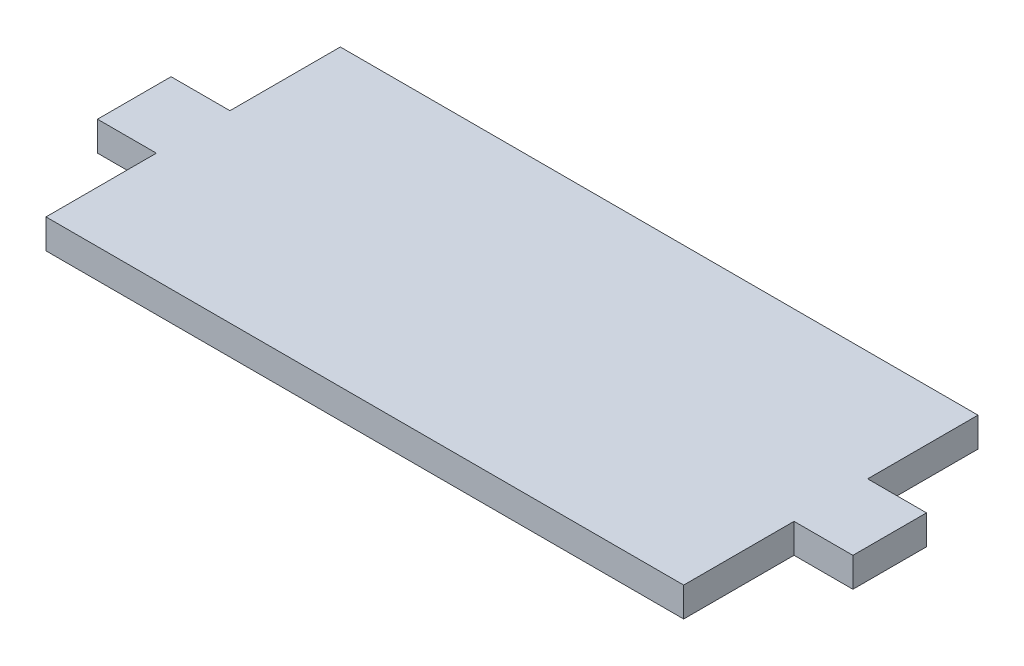
ISO-10303-21;
HEADER;
FILE_DESCRIPTION(('STEP AP214'),'2;1');
FILE_NAME('part.step','',(''),(''),'','','');
FILE_SCHEMA(('AUTOMOTIVE_DESIGN { 1 0 10303 214 1 1 1 1 }'));
ENDSEC;
DATA;
#1=APPLICATION_CONTEXT('core data for automotive mechanical design processes');
#2=APPLICATION_PROTOCOL_DEFINITION('international standard','automotive_design',2000,#1);
#3=PRODUCT_CONTEXT('',#1,'mechanical');
#4=PRODUCT('Part','Part','',(#3));
#5=PRODUCT_RELATED_PRODUCT_CATEGORY('part','',(#4));
#6=PRODUCT_DEFINITION_FORMATION('','',#4);
#7=PRODUCT_DEFINITION_CONTEXT('part definition',#1,'design');
#8=PRODUCT_DEFINITION('design','',#6,#7);
#9=PRODUCT_DEFINITION_SHAPE('','',#8);
#10=(LENGTH_UNIT() NAMED_UNIT(*) SI_UNIT(.MILLI.,.METRE.));
#11=(NAMED_UNIT(*) PLANE_ANGLE_UNIT() SI_UNIT($,.RADIAN.));
#12=(NAMED_UNIT(*) SI_UNIT($,.STERADIAN.) SOLID_ANGLE_UNIT());
#13=UNCERTAINTY_MEASURE_WITH_UNIT(LENGTH_MEASURE(1.E-05),#10,'distance_accuracy_value','');
#14=(GEOMETRIC_REPRESENTATION_CONTEXT(3) GLOBAL_UNCERTAINTY_ASSIGNED_CONTEXT((#13)) GLOBAL_UNIT_ASSIGNED_CONTEXT((#10,
#11,#12)) REPRESENTATION_CONTEXT('',''));
#15=CARTESIAN_POINT('',(0.,0.,0.));
#16=DIRECTION('',(0.,0.,1.));
#17=DIRECTION('',(1.,0.,0.));
#18=AXIS2_PLACEMENT_3D('',#15,#16,#17);
#19=CARTESIAN_POINT('',(-64.9999999999999,6.,7.50000000000009));
#20=DIRECTION('',(1.,0.,0.));
#21=DIRECTION('',(0.,0.,-1.));
#22=AXIS2_PLACEMENT_3D('',#19,#20,#21);
#23=PLANE('',#22);
#24=DIRECTION('',(0.,0.,1.));
#25=VECTOR('',#24,1.);
#26=CARTESIAN_POINT('',(-64.9999999999999,0.,7.50000000000009));
#27=LINE('',#26,#25);
#28=CARTESIAN_POINT('',(-64.9999999999999,0.,7.50000000000009));
#29=VERTEX_POINT('',#28);
#30=CARTESIAN_POINT('',(-65.,0.,30.));
#31=VERTEX_POINT('',#30);
#32=EDGE_CURVE('E151',#29,#31,#27,.T.);
#33=ORIENTED_EDGE('',*,*,#32,.T.);
#34=DIRECTION('',(0.,-1.,0.));
#35=VECTOR('',#34,1.);
#36=CARTESIAN_POINT('',(-65.,6.,30.));
#37=LINE('',#36,#35);
#38=CARTESIAN_POINT('',(-65.,6.,30.));
#39=VERTEX_POINT('',#38);
#40=EDGE_CURVE('E11',#39,#31,#37,.T.);
#41=ORIENTED_EDGE('',*,*,#40,.F.);
#42=DIRECTION('',(0.,0.,1.));
#43=VECTOR('',#42,1.);
#44=CARTESIAN_POINT('',(-64.9999999999999,6.,7.50000000000009));
#45=LINE('',#44,#43);
#46=CARTESIAN_POINT('',(-64.9999999999999,6.,7.50000000000009));
#47=VERTEX_POINT('',#46);
#48=EDGE_CURVE('E173',#47,#39,#45,.T.);
#49=ORIENTED_EDGE('',*,*,#48,.F.);
#50=DIRECTION('',(0.,-1.,0.));
#51=VECTOR('',#50,1.);
#52=CARTESIAN_POINT('',(-64.9999999999999,6.,7.50000000000009));
#53=LINE('',#52,#51);
#54=EDGE_CURVE('E147',#47,#29,#53,.T.);
#55=ORIENTED_EDGE('',*,*,#54,.T.);
#56=EDGE_LOOP('',(#33,#41,#49,#55));
#57=FACE_BOUND('',#56,.T.);
#58=ADVANCED_FACE('F31',(#57),#23,.F.);
#59=CARTESIAN_POINT('',(65.,6.,30.));
#60=DIRECTION('',(0.,0.,-1.));
#61=DIRECTION('',(-1.,0.,0.));
#62=AXIS2_PLACEMENT_3D('',#59,#60,#61);
#63=PLANE('',#62);
#64=DIRECTION('',(1.,0.,0.));
#65=VECTOR('',#64,1.);
#66=CARTESIAN_POINT('',(65.,0.,30.));
#67=LINE('',#66,#65);
#68=CARTESIAN_POINT('',(65.,0.,30.));
#69=VERTEX_POINT('',#68);
#70=EDGE_CURVE('E154',#31,#69,#67,.T.);
#71=ORIENTED_EDGE('',*,*,#70,.T.);
#72=DIRECTION('',(0.,-1.,0.));
#73=VECTOR('',#72,1.);
#74=CARTESIAN_POINT('',(65.,6.,30.));
#75=LINE('',#74,#73);
#76=CARTESIAN_POINT('',(65.,6.,30.));
#77=VERTEX_POINT('',#76);
#78=EDGE_CURVE('E39',#77,#69,#75,.T.);
#79=ORIENTED_EDGE('',*,*,#78,.F.);
#80=DIRECTION('',(1.,0.,0.));
#81=VECTOR('',#80,1.);
#82=CARTESIAN_POINT('',(65.,6.,30.));
#83=LINE('',#82,#81);
#84=EDGE_CURVE('E102',#39,#77,#83,.T.);
#85=ORIENTED_EDGE('',*,*,#84,.F.);
#86=ORIENTED_EDGE('',*,*,#40,.T.);
#87=EDGE_LOOP('',(#71,#79,#85,#86));
#88=FACE_BOUND('',#87,.T.);
#89=ADVANCED_FACE('F251',(#88),#63,.F.);
#90=CARTESIAN_POINT('',(65.,6.,7.50000000000001));
#91=DIRECTION('',(-1.,0.,0.));
#92=DIRECTION('',(0.,0.,1.));
#93=AXIS2_PLACEMENT_3D('',#90,#91,#92);
#94=PLANE('',#93);
#95=DIRECTION('',(0.,0.,-1.));
#96=VECTOR('',#95,1.);
#97=CARTESIAN_POINT('',(65.,0.,7.50000000000001));
#98=LINE('',#97,#96);
#99=CARTESIAN_POINT('',(65.,0.,7.50000000000001));
#100=VERTEX_POINT('',#99);
#101=EDGE_CURVE('E156',#69,#100,#98,.T.);
#102=ORIENTED_EDGE('',*,*,#101,.T.);
#103=DIRECTION('',(0.,-1.,0.));
#104=VECTOR('',#103,1.);
#105=CARTESIAN_POINT('',(65.,6.,7.50000000000001));
#106=LINE('',#105,#104);
#107=CARTESIAN_POINT('',(65.,6.,7.50000000000001));
#108=VERTEX_POINT('',#107);
#109=EDGE_CURVE('E192',#108,#100,#106,.T.);
#110=ORIENTED_EDGE('',*,*,#109,.F.);
#111=DIRECTION('',(0.,0.,-1.));
#112=VECTOR('',#111,1.);
#113=CARTESIAN_POINT('',(65.,6.,7.50000000000001));
#114=LINE('',#113,#112);
#115=EDGE_CURVE('E200',#77,#108,#114,.T.);
#116=ORIENTED_EDGE('',*,*,#115,.F.);
#117=ORIENTED_EDGE('',*,*,#78,.T.);
#118=EDGE_LOOP('',(#102,#110,#116,#117));
#119=FACE_BOUND('',#118,.T.);
#120=ADVANCED_FACE('F198',(#119),#94,.F.);
#121=CARTESIAN_POINT('',(65.,6.,7.50000000000001));
#122=DIRECTION('',(0.,0.,-1.));
#123=DIRECTION('',(-1.,0.,0.));
#124=AXIS2_PLACEMENT_3D('',#121,#122,#123);
#125=PLANE('',#124);
#126=DIRECTION('',(1.,0.,0.));
#127=VECTOR('',#126,1.);
#128=CARTESIAN_POINT('',(65.,0.,7.50000000000001));
#129=LINE('',#128,#127);
#130=CARTESIAN_POINT('',(77.,0.,7.50000000000001));
#131=VERTEX_POINT('',#130);
#132=EDGE_CURVE('E158',#100,#131,#129,.T.);
#133=ORIENTED_EDGE('',*,*,#132,.T.);
#134=DIRECTION('',(0.,-1.,0.));
#135=VECTOR('',#134,1.);
#136=CARTESIAN_POINT('',(77.,6.,7.50000000000001));
#137=LINE('',#136,#135);
#138=CARTESIAN_POINT('',(77.,6.,7.50000000000001));
#139=VERTEX_POINT('',#138);
#140=EDGE_CURVE('E189',#139,#131,#137,.T.);
#141=ORIENTED_EDGE('',*,*,#140,.F.);
#142=DIRECTION('',(1.,0.,0.));
#143=VECTOR('',#142,1.);
#144=CARTESIAN_POINT('',(65.,6.,7.50000000000001));
#145=LINE('',#144,#143);
#146=EDGE_CURVE('E218',#108,#139,#145,.T.);
#147=ORIENTED_EDGE('',*,*,#146,.F.);
#148=ORIENTED_EDGE('',*,*,#109,.T.);
#149=EDGE_LOOP('',(#133,#141,#147,#148));
#150=FACE_BOUND('',#149,.T.);
#151=ADVANCED_FACE('F209',(#150),#125,.F.);
#152=CARTESIAN_POINT('',(77.,6.,7.50000000000001));
#153=DIRECTION('',(-1.,0.,0.));
#154=DIRECTION('',(0.,0.,1.));
#155=AXIS2_PLACEMENT_3D('',#152,#153,#154);
#156=PLANE('',#155);
#157=DIRECTION('',(0.,0.,-1.));
#158=VECTOR('',#157,1.);
#159=CARTESIAN_POINT('',(77.,0.,7.50000000000001));
#160=LINE('',#159,#158);
#161=CARTESIAN_POINT('',(77.,0.,-7.50000000000001));
#162=VERTEX_POINT('',#161);
#163=EDGE_CURVE('E160',#131,#162,#160,.T.);
#164=ORIENTED_EDGE('',*,*,#163,.T.);
#165=DIRECTION('',(0.,-1.,0.));
#166=VECTOR('',#165,1.);
#167=CARTESIAN_POINT('',(77.,6.,-7.50000000000001));
#168=LINE('',#167,#166);
#169=CARTESIAN_POINT('',(77.,6.,-7.50000000000001));
#170=VERTEX_POINT('',#169);
#171=EDGE_CURVE('E186',#170,#162,#168,.T.);
#172=ORIENTED_EDGE('',*,*,#171,.F.);
#173=DIRECTION('',(0.,0.,-1.));
#174=VECTOR('',#173,1.);
#175=CARTESIAN_POINT('',(77.,6.,7.50000000000001));
#176=LINE('',#175,#174);
#177=EDGE_CURVE('E215',#139,#170,#176,.T.);
#178=ORIENTED_EDGE('',*,*,#177,.F.);
#179=ORIENTED_EDGE('',*,*,#140,.T.);
#180=EDGE_LOOP('',(#164,#172,#178,#179));
#181=FACE_BOUND('',#180,.T.);
#182=ADVANCED_FACE('F213',(#181),#156,.F.);
#183=CARTESIAN_POINT('',(65.,6.,-7.50000000000001));
#184=DIRECTION('',(0.,0.,1.));
#185=DIRECTION('',(1.,0.,0.));
#186=AXIS2_PLACEMENT_3D('',#183,#184,#185);
#187=PLANE('',#186);
#188=DIRECTION('',(-1.,0.,0.));
#189=VECTOR('',#188,1.);
#190=CARTESIAN_POINT('',(65.,0.,-7.50000000000001));
#191=LINE('',#190,#189);
#192=CARTESIAN_POINT('',(65.,0.,-7.50000000000001));
#193=VERTEX_POINT('',#192);
#194=EDGE_CURVE('E162',#162,#193,#191,.T.);
#195=ORIENTED_EDGE('',*,*,#194,.T.);
#196=DIRECTION('',(0.,-1.,0.));
#197=VECTOR('',#196,1.);
#198=CARTESIAN_POINT('',(65.,6.,-7.50000000000001));
#199=LINE('',#198,#197);
#200=CARTESIAN_POINT('',(65.,6.,-7.50000000000001));
#201=VERTEX_POINT('',#200);
#202=EDGE_CURVE('E183',#201,#193,#199,.T.);
#203=ORIENTED_EDGE('',*,*,#202,.F.);
#204=DIRECTION('',(-1.,0.,0.));
#205=VECTOR('',#204,1.);
#206=CARTESIAN_POINT('',(65.,6.,-7.50000000000001));
#207=LINE('',#206,#205);
#208=EDGE_CURVE('E217',#170,#201,#207,.T.);
#209=ORIENTED_EDGE('',*,*,#208,.F.);
#210=ORIENTED_EDGE('',*,*,#171,.T.);
#211=EDGE_LOOP('',(#195,#203,#209,#210));
#212=FACE_BOUND('',#211,.T.);
#213=ADVANCED_FACE('F264',(#212),#187,.F.);
#214=CARTESIAN_POINT('',(65.,6.,-30.));
#215=DIRECTION('',(-1.,0.,0.));
#216=DIRECTION('',(0.,0.,1.));
#217=AXIS2_PLACEMENT_3D('',#214,#215,#216);
#218=PLANE('',#217);
#219=DIRECTION('',(0.,0.,-1.));
#220=VECTOR('',#219,1.);
#221=CARTESIAN_POINT('',(65.,0.,-30.));
#222=LINE('',#221,#220);
#223=CARTESIAN_POINT('',(65.,0.,-30.));
#224=VERTEX_POINT('',#223);
#225=EDGE_CURVE('E164',#193,#224,#222,.T.);
#226=ORIENTED_EDGE('',*,*,#225,.T.);
#227=DIRECTION('',(0.,-1.,0.));
#228=VECTOR('',#227,1.);
#229=CARTESIAN_POINT('',(65.,6.,-30.));
#230=LINE('',#229,#228);
#231=CARTESIAN_POINT('',(65.,6.,-30.));
#232=VERTEX_POINT('',#231);
#233=EDGE_CURVE('E180',#232,#224,#230,.T.);
#234=ORIENTED_EDGE('',*,*,#233,.F.);
#235=DIRECTION('',(0.,0.,-1.));
#236=VECTOR('',#235,1.);
#237=CARTESIAN_POINT('',(65.,6.,-30.));
#238=LINE('',#237,#236);
#239=EDGE_CURVE('E220',#201,#232,#238,.T.);
#240=ORIENTED_EDGE('',*,*,#239,.F.);
#241=ORIENTED_EDGE('',*,*,#202,.T.);
#242=EDGE_LOOP('',(#226,#234,#240,#241));
#243=FACE_BOUND('',#242,.T.);
#244=ADVANCED_FACE('F267',(#243),#218,.F.);
#245=CARTESIAN_POINT('',(65.,6.,-30.));
#246=DIRECTION('',(0.,0.,1.));
#247=DIRECTION('',(1.,0.,0.));
#248=AXIS2_PLACEMENT_3D('',#245,#246,#247);
#249=PLANE('',#248);
#250=DIRECTION('',(-1.,0.,0.));
#251=VECTOR('',#250,1.);
#252=CARTESIAN_POINT('',(65.,0.,-30.));
#253=LINE('',#252,#251);
#254=CARTESIAN_POINT('',(-65.,0.,-30.));
#255=VERTEX_POINT('',#254);
#256=EDGE_CURVE('E166',#224,#255,#253,.T.);
#257=ORIENTED_EDGE('',*,*,#256,.T.);
#258=DIRECTION('',(0.,-1.,0.));
#259=VECTOR('',#258,1.);
#260=CARTESIAN_POINT('',(-65.,6.,-30.));
#261=LINE('',#260,#259);
#262=CARTESIAN_POINT('',(-65.,6.,-30.));
#263=VERTEX_POINT('',#262);
#264=EDGE_CURVE('E177',#263,#255,#261,.T.);
#265=ORIENTED_EDGE('',*,*,#264,.F.);
#266=DIRECTION('',(-1.,0.,0.));
#267=VECTOR('',#266,1.);
#268=CARTESIAN_POINT('',(65.,6.,-30.));
#269=LINE('',#268,#267);
#270=EDGE_CURVE('E226',#232,#263,#269,.T.);
#271=ORIENTED_EDGE('',*,*,#270,.F.);
#272=ORIENTED_EDGE('',*,*,#233,.T.);
#273=EDGE_LOOP('',(#257,#265,#271,#272));
#274=FACE_BOUND('',#273,.T.);
#275=ADVANCED_FACE('F232',(#274),#249,.F.);
#276=CARTESIAN_POINT('',(-65.,6.,-30.));
#277=DIRECTION('',(1.,0.,0.));
#278=DIRECTION('',(0.,0.,-1.));
#279=AXIS2_PLACEMENT_3D('',#276,#277,#278);
#280=PLANE('',#279);
#281=DIRECTION('',(0.,0.,1.));
#282=VECTOR('',#281,1.);
#283=CARTESIAN_POINT('',(-65.,0.,-30.));
#284=LINE('',#283,#282);
#285=CARTESIAN_POINT('',(-65.,0.,-7.49999999999987));
#286=VERTEX_POINT('',#285);
#287=EDGE_CURVE('E168',#255,#286,#284,.T.);
#288=ORIENTED_EDGE('',*,*,#287,.T.);
#289=DIRECTION('',(0.,-1.,0.));
#290=VECTOR('',#289,1.);
#291=CARTESIAN_POINT('',(-65.,6.,-7.49999999999987));
#292=LINE('',#291,#290);
#293=CARTESIAN_POINT('',(-65.,6.,-7.49999999999987));
#294=VERTEX_POINT('',#293);
#295=EDGE_CURVE('E142',#294,#286,#292,.T.);
#296=ORIENTED_EDGE('',*,*,#295,.F.);
#297=DIRECTION('',(0.,0.,1.));
#298=VECTOR('',#297,1.);
#299=CARTESIAN_POINT('',(-65.,6.,-30.));
#300=LINE('',#299,#298);
#301=EDGE_CURVE('E133',#263,#294,#300,.T.);
#302=ORIENTED_EDGE('',*,*,#301,.F.);
#303=ORIENTED_EDGE('',*,*,#264,.T.);
#304=EDGE_LOOP('',(#288,#296,#302,#303));
#305=FACE_BOUND('',#304,.T.);
#306=ADVANCED_FACE('F236',(#305),#280,.F.);
#307=CARTESIAN_POINT('',(-65.,6.,-7.49999999999987));
#308=DIRECTION('',(0.,0.,1.));
#309=DIRECTION('',(1.,0.,0.));
#310=AXIS2_PLACEMENT_3D('',#307,#308,#309);
#311=PLANE('',#310);
#312=DIRECTION('',(-1.,0.,0.));
#313=VECTOR('',#312,1.);
#314=CARTESIAN_POINT('',(-65.,0.,-7.49999999999987));
#315=LINE('',#314,#313);
#316=CARTESIAN_POINT('',(-77.,0.,-7.49999999999987));
#317=VERTEX_POINT('',#316);
#318=EDGE_CURVE('E141',#286,#317,#315,.T.);
#319=ORIENTED_EDGE('',*,*,#318,.T.);
#320=DIRECTION('',(0.,-1.,0.));
#321=VECTOR('',#320,1.);
#322=CARTESIAN_POINT('',(-77.,6.,-7.49999999999987));
#323=LINE('',#322,#321);
#324=CARTESIAN_POINT('',(-77.,6.,-7.49999999999987));
#325=VERTEX_POINT('',#324);
#326=EDGE_CURVE('E138',#325,#317,#323,.T.);
#327=ORIENTED_EDGE('',*,*,#326,.F.);
#328=DIRECTION('',(-1.,0.,0.));
#329=VECTOR('',#328,1.);
#330=CARTESIAN_POINT('',(-65.,6.,-7.49999999999987));
#331=LINE('',#330,#329);
#332=EDGE_CURVE('E127',#294,#325,#331,.T.);
#333=ORIENTED_EDGE('',*,*,#332,.F.);
#334=ORIENTED_EDGE('',*,*,#295,.T.);
#335=EDGE_LOOP('',(#319,#327,#333,#334));
#336=FACE_BOUND('',#335,.T.);
#337=ADVANCED_FACE('F139',(#336),#311,.F.);
#338=CARTESIAN_POINT('',(-76.9999999999999,6.,7.50000000000012));
#339=DIRECTION('',(1.,0.,0.));
#340=DIRECTION('',(0.,0.,-1.));
#341=AXIS2_PLACEMENT_3D('',#338,#339,#340);
#342=PLANE('',#341);
#343=DIRECTION('',(0.,0.,1.));
#344=VECTOR('',#343,1.);
#345=CARTESIAN_POINT('',(-76.9999999999999,0.,7.50000000000012));
#346=LINE('',#345,#344);
#347=CARTESIAN_POINT('',(-76.9999999999999,0.,7.50000000000012));
#348=VERTEX_POINT('',#347);
#349=EDGE_CURVE('E88',#317,#348,#346,.T.);
#350=ORIENTED_EDGE('',*,*,#349,.T.);
#351=DIRECTION('',(0.,-1.,0.));
#352=VECTOR('',#351,1.);
#353=CARTESIAN_POINT('',(-76.9999999999999,6.,7.50000000000012));
#354=LINE('',#353,#352);
#355=CARTESIAN_POINT('',(-76.9999999999999,6.,7.50000000000012));
#356=VERTEX_POINT('',#355);
#357=EDGE_CURVE('E143',#356,#348,#354,.T.);
#358=ORIENTED_EDGE('',*,*,#357,.F.);
#359=DIRECTION('',(0.,0.,1.));
#360=VECTOR('',#359,1.);
#361=CARTESIAN_POINT('',(-76.9999999999999,6.,7.50000000000012));
#362=LINE('',#361,#360);
#363=EDGE_CURVE('E131',#325,#356,#362,.T.);
#364=ORIENTED_EDGE('',*,*,#363,.F.);
#365=ORIENTED_EDGE('',*,*,#326,.T.);
#366=EDGE_LOOP('',(#350,#358,#364,#365));
#367=FACE_BOUND('',#366,.T.);
#368=ADVANCED_FACE('F145',(#367),#342,.F.);
#369=CARTESIAN_POINT('',(-64.9999999999999,6.,7.50000000000009));
#370=DIRECTION('',(0.,0.,-1.));
#371=DIRECTION('',(-1.,0.,0.));
#372=AXIS2_PLACEMENT_3D('',#369,#370,#371);
#373=PLANE('',#372);
#374=DIRECTION('',(1.,0.,0.));
#375=VECTOR('',#374,1.);
#376=CARTESIAN_POINT('',(-64.9999999999999,0.,7.50000000000009));
#377=LINE('',#376,#375);
#378=EDGE_CURVE('E94',#348,#29,#377,.T.);
#379=ORIENTED_EDGE('',*,*,#378,.T.);
#380=ORIENTED_EDGE('',*,*,#54,.F.);
#381=DIRECTION('',(1.,0.,0.));
#382=VECTOR('',#381,1.);
#383=CARTESIAN_POINT('',(-64.9999999999999,6.,7.50000000000009));
#384=LINE('',#383,#382);
#385=EDGE_CURVE('E47',#356,#47,#384,.T.);
#386=ORIENTED_EDGE('',*,*,#385,.F.);
#387=ORIENTED_EDGE('',*,*,#357,.T.);
#388=EDGE_LOOP('',(#379,#380,#386,#387));
#389=FACE_BOUND('',#388,.T.);
#390=ADVANCED_FACE('F240',(#389),#373,.F.);
#391=CARTESIAN_POINT('',(0.,6.,0.));
#392=DIRECTION('',(0.,-1.,0.));
#393=DIRECTION('',(0.,0.,-1.));
#394=AXIS2_PLACEMENT_3D('',#391,#392,#393);
#395=PLANE('',#394);
#396=ORIENTED_EDGE('',*,*,#48,.T.);
#397=ORIENTED_EDGE('',*,*,#84,.T.);
#398=ORIENTED_EDGE('',*,*,#115,.T.);
#399=ORIENTED_EDGE('',*,*,#146,.T.);
#400=ORIENTED_EDGE('',*,*,#177,.T.);
#401=ORIENTED_EDGE('',*,*,#208,.T.);
#402=ORIENTED_EDGE('',*,*,#239,.T.);
#403=ORIENTED_EDGE('',*,*,#270,.T.);
#404=ORIENTED_EDGE('',*,*,#301,.T.);
#405=ORIENTED_EDGE('',*,*,#332,.T.);
#406=ORIENTED_EDGE('',*,*,#363,.T.);
#407=ORIENTED_EDGE('',*,*,#385,.T.);
#408=EDGE_LOOP('',(#396,#397,#398,#399,#400,#401,#402,#403,#404,#405,#406,#407));
#409=FACE_BOUND('',#408,.T.);
#410=ADVANCED_FACE('F129',(#409),#395,.F.);
#411=CARTESIAN_POINT('',(0.,0.,0.));
#412=DIRECTION('',(0.,-1.,0.));
#413=DIRECTION('',(0.,0.,-1.));
#414=AXIS2_PLACEMENT_3D('',#411,#412,#413);
#415=PLANE('',#414);
#416=ORIENTED_EDGE('',*,*,#32,.F.);
#417=ORIENTED_EDGE('',*,*,#378,.F.);
#418=ORIENTED_EDGE('',*,*,#349,.F.);
#419=ORIENTED_EDGE('',*,*,#318,.F.);
#420=ORIENTED_EDGE('',*,*,#287,.F.);
#421=ORIENTED_EDGE('',*,*,#256,.F.);
#422=ORIENTED_EDGE('',*,*,#225,.F.);
#423=ORIENTED_EDGE('',*,*,#194,.F.);
#424=ORIENTED_EDGE('',*,*,#163,.F.);
#425=ORIENTED_EDGE('',*,*,#132,.F.);
#426=ORIENTED_EDGE('',*,*,#101,.F.);
#427=ORIENTED_EDGE('',*,*,#70,.F.);
#428=EDGE_LOOP('',(#416,#417,#418,#419,#420,#421,#422,#423,#424,#425,#426,#427));
#429=FACE_BOUND('',#428,.T.);
#430=ADVANCED_FACE('F204',(#429),#415,.T.);
#431=CLOSED_SHELL('',(#58,#89,#120,#151,#182,#213,#244,#275,#306,#337,#368,#390,#410,#430));
#432=MANIFOLD_SOLID_BREP('B2',#431);
#433=ADVANCED_BREP_SHAPE_REPRESENTATION('',(#18,#432),#14);
#434=SHAPE_DEFINITION_REPRESENTATION(#9,#433);
ENDSEC;
END-ISO-10303-21;
